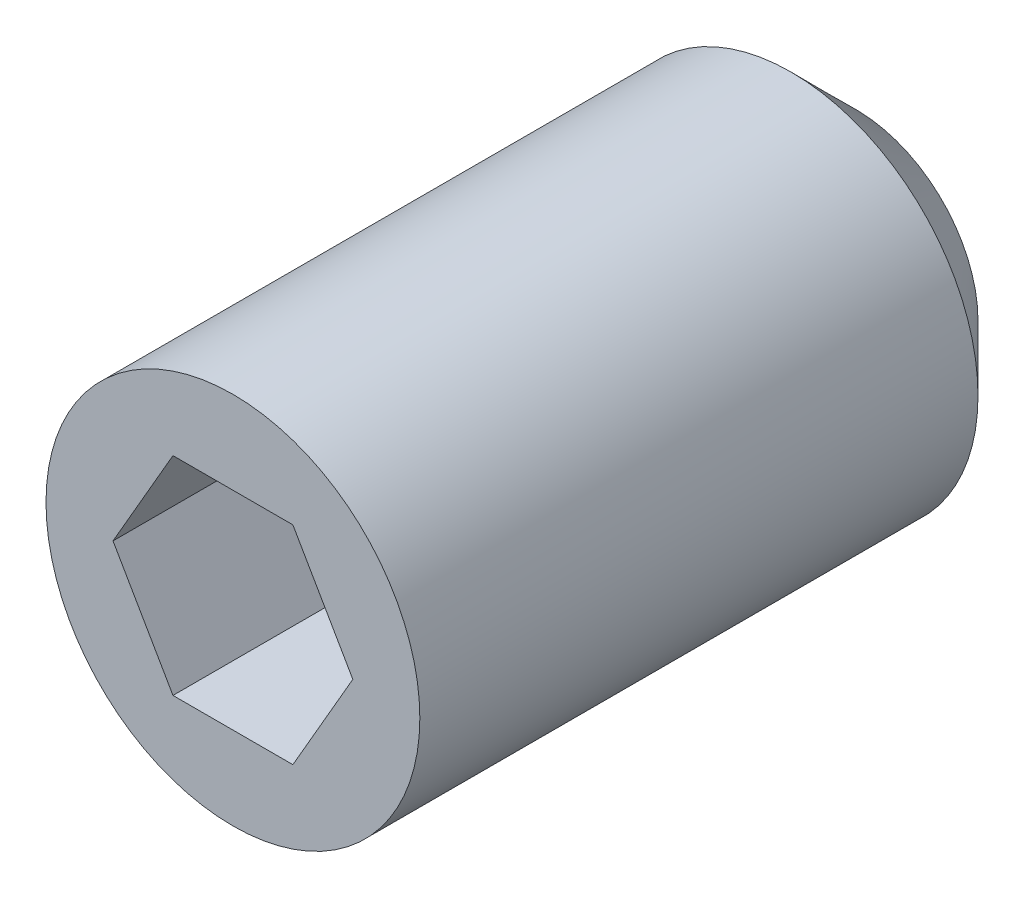
ISO-10303-21;
HEADER;
FILE_DESCRIPTION(('STEP AP214'),'2;1');
FILE_NAME('part.step','',(''),(''),'','','');
FILE_SCHEMA(('AUTOMOTIVE_DESIGN { 1 0 10303 214 1 1 1 1 }'));
ENDSEC;
DATA;
#1=APPLICATION_CONTEXT('core data for automotive mechanical design processes');
#2=APPLICATION_PROTOCOL_DEFINITION('international standard','automotive_design',2000,#1);
#3=PRODUCT_CONTEXT('',#1,'mechanical');
#4=PRODUCT('Part','Part','',(#3));
#5=PRODUCT_RELATED_PRODUCT_CATEGORY('part','',(#4));
#6=PRODUCT_DEFINITION_FORMATION('','',#4);
#7=PRODUCT_DEFINITION_CONTEXT('part definition',#1,'design');
#8=PRODUCT_DEFINITION('design','',#6,#7);
#9=PRODUCT_DEFINITION_SHAPE('','',#8);
#10=(LENGTH_UNIT() NAMED_UNIT(*) SI_UNIT(.MILLI.,.METRE.));
#11=(NAMED_UNIT(*) PLANE_ANGLE_UNIT() SI_UNIT($,.RADIAN.));
#12=(NAMED_UNIT(*) SI_UNIT($,.STERADIAN.) SOLID_ANGLE_UNIT());
#13=UNCERTAINTY_MEASURE_WITH_UNIT(LENGTH_MEASURE(1.E-05),#10,'distance_accuracy_value','');
#14=(GEOMETRIC_REPRESENTATION_CONTEXT(3) GLOBAL_UNCERTAINTY_ASSIGNED_CONTEXT((#13)) GLOBAL_UNIT_ASSIGNED_CONTEXT((#10,
#11,#12)) REPRESENTATION_CONTEXT('',''));
#15=CARTESIAN_POINT('',(0.,0.,0.));
#16=DIRECTION('',(0.,0.,1.));
#17=DIRECTION('',(1.,0.,0.));
#18=AXIS2_PLACEMENT_3D('',#15,#16,#17);
#19=CARTESIAN_POINT('',(0.,0.,3.81));
#20=DIRECTION('',(0.,0.,-1.));
#21=DIRECTION('',(-1.,0.,0.));
#22=AXIS2_PLACEMENT_3D('',#19,#20,#21);
#23=CYLINDRICAL_SURFACE('',#22,1.143);
#24=CARTESIAN_POINT('',(0.,0.,0.396875));
#25=DIRECTION('',(0.,0.,1.));
#26=DIRECTION('',(1.,0.,0.));
#27=AXIS2_PLACEMENT_3D('',#24,#25,#26);
#28=CIRCLE('',#27,1.143);
#29=CARTESIAN_POINT('',(-1.143,0.,0.396875));
#30=VERTEX_POINT('',#29);
#31=EDGE_CURVE('E40',#30,#30,#28,.T.);
#32=CARTESIAN_POINT('',(0.,0.,3.81));
#33=DIRECTION('',(0.,0.,1.));
#34=DIRECTION('',(1.,0.,0.));
#35=AXIS2_PLACEMENT_3D('',#32,#33,#34);
#36=CIRCLE('',#35,1.143);
#37=CARTESIAN_POINT('',(-1.143,0.,3.81));
#38=VERTEX_POINT('',#37);
#39=EDGE_CURVE('E134',#38,#38,#36,.T.);
#40=CARTESIAN_POINT('',(-1.143,0.,0.396875));
#41=CARTESIAN_POINT('',(-1.143,0.,0.432428385416666));
#42=CARTESIAN_POINT('',(-1.143,0.,0.467981770833333));
#43=CARTESIAN_POINT('',(-1.143,0.,0.539088541666666));
#44=CARTESIAN_POINT('',(-1.143,0.,0.574641927083333));
#45=CARTESIAN_POINT('',(-1.143,0.,0.645748697916666));
#46=CARTESIAN_POINT('',(-1.143,0.,0.681302083333333));
#47=CARTESIAN_POINT('',(-1.143,0.,0.752408854166666));
#48=CARTESIAN_POINT('',(-1.143,0.,0.787962239583333));
#49=CARTESIAN_POINT('',(-1.143,0.,0.859069010416666));
#50=CARTESIAN_POINT('',(-1.143,0.,0.894622395833333));
#51=CARTESIAN_POINT('',(-1.143,0.,0.965729166666666));
#52=CARTESIAN_POINT('',(-1.143,0.,1.00128255208333));
#53=CARTESIAN_POINT('',(-1.143,0.,1.07238932291667));
#54=CARTESIAN_POINT('',(-1.143,0.,1.10794270833333));
#55=CARTESIAN_POINT('',(-1.143,0.,1.17904947916667));
#56=CARTESIAN_POINT('',(-1.143,0.,1.21460286458333));
#57=CARTESIAN_POINT('',(-1.143,0.,1.28570963541667));
#58=CARTESIAN_POINT('',(-1.143,0.,1.32126302083333));
#59=CARTESIAN_POINT('',(-1.143,0.,1.39236979166667));
#60=CARTESIAN_POINT('',(-1.143,0.,1.42792317708333));
#61=CARTESIAN_POINT('',(-1.143,0.,1.49902994791667));
#62=CARTESIAN_POINT('',(-1.143,0.,1.53458333333333));
#63=CARTESIAN_POINT('',(-1.143,0.,1.60569010416667));
#64=CARTESIAN_POINT('',(-1.143,0.,1.64124348958333));
#65=CARTESIAN_POINT('',(-1.143,0.,1.71235026041667));
#66=CARTESIAN_POINT('',(-1.143,0.,1.74790364583333));
#67=CARTESIAN_POINT('',(-1.143,0.,1.81901041666667));
#68=CARTESIAN_POINT('',(-1.143,0.,1.85456380208333));
#69=CARTESIAN_POINT('',(-1.143,0.,1.92567057291667));
#70=CARTESIAN_POINT('',(-1.143,0.,1.96122395833333));
#71=CARTESIAN_POINT('',(-1.143,0.,2.03233072916667));
#72=CARTESIAN_POINT('',(-1.143,0.,2.06788411458333));
#73=CARTESIAN_POINT('',(-1.143,0.,2.13899088541667));
#74=CARTESIAN_POINT('',(-1.143,0.,2.17454427083333));
#75=CARTESIAN_POINT('',(-1.143,0.,2.24565104166667));
#76=CARTESIAN_POINT('',(-1.143,0.,2.28120442708333));
#77=CARTESIAN_POINT('',(-1.143,0.,2.35231119791667));
#78=CARTESIAN_POINT('',(-1.143,0.,2.38786458333333));
#79=CARTESIAN_POINT('',(-1.143,0.,2.45897135416667));
#80=CARTESIAN_POINT('',(-1.143,0.,2.49452473958333));
#81=CARTESIAN_POINT('',(-1.143,0.,2.56563151041667));
#82=CARTESIAN_POINT('',(-1.143,0.,2.60118489583333));
#83=CARTESIAN_POINT('',(-1.143,0.,2.67229166666667));
#84=CARTESIAN_POINT('',(-1.143,0.,2.70784505208333));
#85=CARTESIAN_POINT('',(-1.143,0.,2.77895182291667));
#86=CARTESIAN_POINT('',(-1.143,0.,2.81450520833333));
#87=CARTESIAN_POINT('',(-1.143,0.,2.88561197916667));
#88=CARTESIAN_POINT('',(-1.143,0.,2.92116536458333));
#89=CARTESIAN_POINT('',(-1.143,0.,2.99227213541667));
#90=CARTESIAN_POINT('',(-1.143,0.,3.02782552083333));
#91=CARTESIAN_POINT('',(-1.143,0.,3.09893229166667));
#92=CARTESIAN_POINT('',(-1.143,0.,3.13448567708333));
#93=CARTESIAN_POINT('',(-1.143,0.,3.20559244791667));
#94=CARTESIAN_POINT('',(-1.143,0.,3.24114583333333));
#95=CARTESIAN_POINT('',(-1.143,0.,3.31225260416667));
#96=CARTESIAN_POINT('',(-1.143,0.,3.34780598958333));
#97=CARTESIAN_POINT('',(-1.143,0.,3.41891276041667));
#98=CARTESIAN_POINT('',(-1.143,0.,3.45446614583333));
#99=CARTESIAN_POINT('',(-1.143,0.,3.52557291666667));
#100=CARTESIAN_POINT('',(-1.143,0.,3.56112630208333));
#101=CARTESIAN_POINT('',(-1.143,0.,3.63223307291667));
#102=CARTESIAN_POINT('',(-1.143,0.,3.66778645833333));
#103=CARTESIAN_POINT('',(-1.143,0.,3.73889322916667));
#104=CARTESIAN_POINT('',(-1.143,0.,3.77444661458333));
#105=CARTESIAN_POINT('',(-1.143,0.,3.81));
#106=B_SPLINE_CURVE_WITH_KNOTS('',3,(#40,#41,#42,#43,#44,#45,#46,#47,#48,#49,#50,#51,#52,#53,
#54,#55,#56,#57,#58,#59,#60,#61,#62,#63,#64,#65,#66,#67,#68,#69,#70,#71,#72,#73,#74,#75,#76,#77,
#78,#79,#80,#81,#82,#83,#84,#85,#86,#87,#88,#89,#90,#91,#92,#93,#94,#95,#96,#97,#98,#99,#100,
#101,#102,#103,#104,#105),.UNSPECIFIED.,.F.,.F.,(4,2,2,2,2,2,2,2,2,2,2,2,2,2,2,2,2,2,2,2,2,2,2,
2,2,2,2,2,2,2,2,2,4),(0.,0.10666015625,0.2133203125,0.31998046875,0.426640625,0.53330078125,
0.6399609375,0.74662109375,0.85328125,0.95994140625,1.0666015625,1.17326171875,1.279921875,
1.38658203125,1.4932421875,1.59990234375,1.7065625,1.81322265625,1.9198828125,2.02654296875,
2.133203125,2.23986328125,2.3465234375,2.45318359375,2.55984375,2.66650390625,2.7731640625,
2.87982421875,2.986484375,3.09314453125,3.1998046875,3.30646484375,3.413125),.UNSPECIFIED.);
#107=EDGE_CURVE('BSEAM32',#30,#38,#106,.T.);
#108=ORIENTED_EDGE('',*,*,#31,.T.);
#109=ORIENTED_EDGE('',*,*,#39,.F.);
#110=ORIENTED_EDGE('',*,*,#107,.T.);
#111=ORIENTED_EDGE('',*,*,#107,.F.);
#112=EDGE_LOOP('',(#108,#110,#109,#111));
#113=FACE_BOUND('',#112,.T.);
#114=ADVANCED_FACE('F32',(#113),#23,.T.);
#115=CARTESIAN_POINT('',(0.,0.,3.81));
#116=DIRECTION('',(0.,0.,1.));
#117=DIRECTION('',(1.,0.,0.));
#118=AXIS2_PLACEMENT_3D('',#115,#116,#117);
#119=PLANE('',#118);
#120=DIRECTION('',(-0.5,-0.866025403784439,0.));
#121=VECTOR('',#120,1.);
#122=CARTESIAN_POINT('',(-0.733234841870825,0.,3.80999999999764));
#123=LINE('',#122,#121);
#124=CARTESIAN_POINT('',(-0.366617420935412,0.635,3.80999999999764));
#125=VERTEX_POINT('',#124);
#126=CARTESIAN_POINT('',(-0.733234841870825,0.,3.81));
#127=VERTEX_POINT('',#126);
#128=EDGE_CURVE('E47',#125,#127,#123,.T.);
#129=ORIENTED_EDGE('',*,*,#128,.F.);
#130=DIRECTION('',(-1.,0.,0.));
#131=VECTOR('',#130,1.);
#132=CARTESIAN_POINT('',(-0.366617420935412,0.635,3.80999999999764));
#133=LINE('',#132,#131);
#134=CARTESIAN_POINT('',(0.366617420935412,0.635,3.80999999999764));
#135=VERTEX_POINT('',#134);
#136=EDGE_CURVE('E130',#135,#125,#133,.T.);
#137=ORIENTED_EDGE('',*,*,#136,.F.);
#138=DIRECTION('',(-0.5,0.866025403784439,0.));
#139=VECTOR('',#138,1.);
#140=CARTESIAN_POINT('',(0.366617420935412,0.635,3.80999999999764));
#141=LINE('',#140,#139);
#142=CARTESIAN_POINT('',(0.733234841870825,0.,3.80999999999764));
#143=VERTEX_POINT('',#142);
#144=EDGE_CURVE('E128',#143,#135,#141,.T.);
#145=ORIENTED_EDGE('',*,*,#144,.F.);
#146=DIRECTION('',(0.5,0.866025403784439,0.));
#147=VECTOR('',#146,1.);
#148=CARTESIAN_POINT('',(0.733234841870825,0.,3.80999999999764));
#149=LINE('',#148,#147);
#150=CARTESIAN_POINT('',(0.366617420935412,-0.635,3.80999999999764));
#151=VERTEX_POINT('',#150);
#152=EDGE_CURVE('E95',#151,#143,#149,.T.);
#153=ORIENTED_EDGE('',*,*,#152,.F.);
#154=DIRECTION('',(1.,0.,0.));
#155=VECTOR('',#154,1.);
#156=CARTESIAN_POINT('',(0.366617420935412,-0.635,3.80999999999764));
#157=LINE('',#156,#155);
#158=CARTESIAN_POINT('',(-0.366617420935412,-0.635,3.80999999999764));
#159=VERTEX_POINT('',#158);
#160=EDGE_CURVE('E124',#159,#151,#157,.T.);
#161=ORIENTED_EDGE('',*,*,#160,.F.);
#162=DIRECTION('',(0.5,-0.866025403784439,0.));
#163=VECTOR('',#162,1.);
#164=CARTESIAN_POINT('',(-0.366617420935412,-0.635,3.80999999999764));
#165=LINE('',#164,#163);
#166=EDGE_CURVE('E121',#127,#159,#165,.T.);
#167=ORIENTED_EDGE('',*,*,#166,.F.);
#168=EDGE_LOOP('',(#129,#137,#145,#153,#161,#167));
#169=FACE_BOUND('',#168,.T.);
#170=ORIENTED_EDGE('',*,*,#39,.T.);
#171=EDGE_LOOP('',(#170));
#172=FACE_BOUND('',#171,.T.);
#173=ADVANCED_FACE('F155',(#169,#172),#119,.T.);
#174=CARTESIAN_POINT('',(0.,0.,0.));
#175=DIRECTION('',(0.,0.,1.));
#176=DIRECTION('',(1.,0.,0.));
#177=AXIS2_PLACEMENT_3D('',#174,#175,#176);
#178=PLANE('',#177);
#179=CARTESIAN_POINT('',(0.,0.,0.));
#180=DIRECTION('',(0.,0.,1.));
#181=DIRECTION('',(1.,0.,0.));
#182=AXIS2_PLACEMENT_3D('',#179,#180,#181);
#183=CIRCLE('',#182,0.746125);
#184=CARTESIAN_POINT('',(0.746125,0.,0.));
#185=VERTEX_POINT('',#184);
#186=EDGE_CURVE('E11',#185,#185,#183,.F.);
#187=ORIENTED_EDGE('',*,*,#186,.T.);
#188=EDGE_LOOP('',(#187));
#189=FACE_BOUND('',#188,.T.);
#190=ADVANCED_FACE('F159',(#189),#178,.F.);
#191=CARTESIAN_POINT('',(-0.733234841870825,0.,2.22249999999764));
#192=DIRECTION('',(-0.866025403784439,0.5,0.));
#193=DIRECTION('',(-0.5,-0.866025403784439,0.));
#194=AXIS2_PLACEMENT_3D('',#191,#192,#193);
#195=PLANE('',#194);
#196=ORIENTED_EDGE('',*,*,#128,.T.);
#197=DIRECTION('',(0.,0.,1.));
#198=VECTOR('',#197,1.);
#199=CARTESIAN_POINT('',(-0.733234841870825,0.,2.22249999999764));
#200=LINE('',#199,#198);
#201=CARTESIAN_POINT('',(-0.733234841870825,0.,2.22249999999764));
#202=VERTEX_POINT('',#201);
#203=EDGE_CURVE('E77',#202,#127,#200,.T.);
#204=ORIENTED_EDGE('',*,*,#203,.F.);
#205=DIRECTION('',(-0.5,-0.866025403784439,0.));
#206=VECTOR('',#205,1.);
#207=CARTESIAN_POINT('',(-0.733234841870825,0.,2.22249999999764));
#208=LINE('',#207,#206);
#209=CARTESIAN_POINT('',(-0.366617420935412,0.635,2.22249999999764));
#210=VERTEX_POINT('',#209);
#211=EDGE_CURVE('E132',#210,#202,#208,.T.);
#212=ORIENTED_EDGE('',*,*,#211,.F.);
#213=DIRECTION('',(0.,0.,1.));
#214=VECTOR('',#213,1.);
#215=CARTESIAN_POINT('',(-0.366617420935412,0.635,2.22249999999764));
#216=LINE('',#215,#214);
#217=EDGE_CURVE('E55',#210,#125,#216,.T.);
#218=ORIENTED_EDGE('',*,*,#217,.T.);
#219=EDGE_LOOP('',(#196,#204,#212,#218));
#220=FACE_BOUND('',#219,.T.);
#221=ADVANCED_FACE('F164',(#220),#195,.F.);
#222=CARTESIAN_POINT('',(-0.366617420935412,0.635,2.22249999999764));
#223=DIRECTION('',(0.,1.,0.));
#224=DIRECTION('',(0.,0.,1.));
#225=AXIS2_PLACEMENT_3D('',#222,#223,#224);
#226=PLANE('',#225);
#227=ORIENTED_EDGE('',*,*,#136,.T.);
#228=ORIENTED_EDGE('',*,*,#217,.F.);
#229=DIRECTION('',(-1.,0.,0.));
#230=VECTOR('',#229,1.);
#231=CARTESIAN_POINT('',(-0.366617420935412,0.635,2.22249999999764));
#232=LINE('',#231,#230);
#233=CARTESIAN_POINT('',(0.366617420935412,0.635,2.22249999999764));
#234=VERTEX_POINT('',#233);
#235=EDGE_CURVE('E107',#234,#210,#232,.T.);
#236=ORIENTED_EDGE('',*,*,#235,.F.);
#237=DIRECTION('',(0.,0.,1.));
#238=VECTOR('',#237,1.);
#239=CARTESIAN_POINT('',(0.366617420935412,0.635,2.22249999999764));
#240=LINE('',#239,#238);
#241=EDGE_CURVE('E99',#234,#135,#240,.T.);
#242=ORIENTED_EDGE('',*,*,#241,.T.);
#243=EDGE_LOOP('',(#227,#228,#236,#242));
#244=FACE_BOUND('',#243,.T.);
#245=ADVANCED_FACE('F169',(#244),#226,.F.);
#246=CARTESIAN_POINT('',(0.366617420935412,0.635,2.22249999999764));
#247=DIRECTION('',(0.866025403784439,0.5,0.));
#248=DIRECTION('',(-0.5,0.866025403784439,0.));
#249=AXIS2_PLACEMENT_3D('',#246,#247,#248);
#250=PLANE('',#249);
#251=ORIENTED_EDGE('',*,*,#144,.T.);
#252=ORIENTED_EDGE('',*,*,#241,.F.);
#253=DIRECTION('',(-0.5,0.866025403784439,0.));
#254=VECTOR('',#253,1.);
#255=CARTESIAN_POINT('',(0.366617420935412,0.635,2.22249999999764));
#256=LINE('',#255,#254);
#257=CARTESIAN_POINT('',(0.733234841870825,0.,2.22249999999764));
#258=VERTEX_POINT('',#257);
#259=EDGE_CURVE('E103',#258,#234,#256,.T.);
#260=ORIENTED_EDGE('',*,*,#259,.F.);
#261=DIRECTION('',(0.,0.,1.));
#262=VECTOR('',#261,1.);
#263=CARTESIAN_POINT('',(0.733234841870825,0.,2.22249999999764));
#264=LINE('',#263,#262);
#265=EDGE_CURVE('E88',#258,#143,#264,.T.);
#266=ORIENTED_EDGE('',*,*,#265,.T.);
#267=EDGE_LOOP('',(#251,#252,#260,#266));
#268=FACE_BOUND('',#267,.T.);
#269=ADVANCED_FACE('F104',(#268),#250,.F.);
#270=CARTESIAN_POINT('',(0.733234841870825,0.,2.22249999999764));
#271=DIRECTION('',(0.866025403784439,-0.5,0.));
#272=DIRECTION('',(0.5,0.866025403784439,0.));
#273=AXIS2_PLACEMENT_3D('',#270,#271,#272);
#274=PLANE('',#273);
#275=ORIENTED_EDGE('',*,*,#152,.T.);
#276=ORIENTED_EDGE('',*,*,#265,.F.);
#277=DIRECTION('',(0.5,0.866025403784439,0.));
#278=VECTOR('',#277,1.);
#279=CARTESIAN_POINT('',(0.733234841870825,0.,2.22249999999764));
#280=LINE('',#279,#278);
#281=CARTESIAN_POINT('',(0.366617420935412,-0.635,2.22249999999764));
#282=VERTEX_POINT('',#281);
#283=EDGE_CURVE('E92',#282,#258,#280,.T.);
#284=ORIENTED_EDGE('',*,*,#283,.F.);
#285=DIRECTION('',(0.,0.,1.));
#286=VECTOR('',#285,1.);
#287=CARTESIAN_POINT('',(0.366617420935412,-0.635,2.22249999999764));
#288=LINE('',#287,#286);
#289=EDGE_CURVE('E100',#282,#151,#288,.T.);
#290=ORIENTED_EDGE('',*,*,#289,.T.);
#291=EDGE_LOOP('',(#275,#276,#284,#290));
#292=FACE_BOUND('',#291,.T.);
#293=ADVANCED_FACE('F90',(#292),#274,.F.);
#294=CARTESIAN_POINT('',(0.366617420935412,-0.635,2.22249999999764));
#295=DIRECTION('',(0.,-1.,0.));
#296=DIRECTION('',(1.,0.,0.));
#297=AXIS2_PLACEMENT_3D('',#294,#295,#296);
#298=PLANE('',#297);
#299=ORIENTED_EDGE('',*,*,#160,.T.);
#300=ORIENTED_EDGE('',*,*,#289,.F.);
#301=DIRECTION('',(1.,0.,0.));
#302=VECTOR('',#301,1.);
#303=CARTESIAN_POINT('',(0.366617420935412,-0.635,2.22249999999764));
#304=LINE('',#303,#302);
#305=CARTESIAN_POINT('',(-0.366617420935412,-0.635,2.22249999999764));
#306=VERTEX_POINT('',#305);
#307=EDGE_CURVE('E113',#306,#282,#304,.T.);
#308=ORIENTED_EDGE('',*,*,#307,.F.);
#309=DIRECTION('',(0.,0.,1.));
#310=VECTOR('',#309,1.);
#311=CARTESIAN_POINT('',(-0.366617420935412,-0.635,2.22249999999764));
#312=LINE('',#311,#310);
#313=EDGE_CURVE('E137',#306,#159,#312,.T.);
#314=ORIENTED_EDGE('',*,*,#313,.T.);
#315=EDGE_LOOP('',(#299,#300,#308,#314));
#316=FACE_BOUND('',#315,.T.);
#317=ADVANCED_FACE('F172',(#316),#298,.F.);
#318=CARTESIAN_POINT('',(-0.366617420935412,-0.635,2.22249999999764));
#319=DIRECTION('',(-0.866025403784439,-0.5,0.));
#320=DIRECTION('',(0.5,-0.866025403784439,0.));
#321=AXIS2_PLACEMENT_3D('',#318,#319,#320);
#322=PLANE('',#321);
#323=ORIENTED_EDGE('',*,*,#166,.T.);
#324=ORIENTED_EDGE('',*,*,#313,.F.);
#325=DIRECTION('',(0.5,-0.866025403784439,0.));
#326=VECTOR('',#325,1.);
#327=CARTESIAN_POINT('',(-0.366617420935412,-0.635,2.22249999999764));
#328=LINE('',#327,#326);
#329=EDGE_CURVE('E115',#202,#306,#328,.T.);
#330=ORIENTED_EDGE('',*,*,#329,.F.);
#331=ORIENTED_EDGE('',*,*,#203,.T.);
#332=EDGE_LOOP('',(#323,#324,#330,#331));
#333=FACE_BOUND('',#332,.T.);
#334=ADVANCED_FACE('F151',(#333),#322,.F.);
#335=CARTESIAN_POINT('',(-1.09985226280624,-0.635,2.22249999999764));
#336=DIRECTION('',(0.,0.,1.));
#337=DIRECTION('',(1.,0.,0.));
#338=AXIS2_PLACEMENT_3D('',#335,#336,#337);
#339=PLANE('',#338);
#340=ORIENTED_EDGE('',*,*,#211,.T.);
#341=ORIENTED_EDGE('',*,*,#329,.T.);
#342=ORIENTED_EDGE('',*,*,#307,.T.);
#343=ORIENTED_EDGE('',*,*,#283,.T.);
#344=ORIENTED_EDGE('',*,*,#259,.T.);
#345=ORIENTED_EDGE('',*,*,#235,.T.);
#346=EDGE_LOOP('',(#340,#341,#342,#343,#344,#345));
#347=FACE_BOUND('',#346,.T.);
#348=ADVANCED_FACE('F110',(#347),#339,.T.);
#349=CARTESIAN_POINT('',(0.,0.,0.396875));
#350=DIRECTION('',(0.,0.,1.));
#351=DIRECTION('',(1.,0.,0.));
#352=AXIS2_PLACEMENT_3D('',#349,#350,#351);
#353=CONICAL_SURFACE('',#352,1.143,0.78539816339745);
#354=ORIENTED_EDGE('',*,*,#186,.F.);
#355=EDGE_LOOP('',(#354));
#356=FACE_BOUND('',#355,.T.);
#357=ORIENTED_EDGE('',*,*,#31,.F.);
#358=EDGE_LOOP('',(#357));
#359=FACE_BOUND('',#358,.T.);
#360=ADVANCED_FACE('F34',(#356,#359),#353,.T.);
#361=CLOSED_SHELL('',(#114,#173,#190,#221,#245,#269,#293,#317,#334,#348,#360));
#362=MANIFOLD_SOLID_BREP('B2',#361);
#363=ADVANCED_BREP_SHAPE_REPRESENTATION('',(#18,#362),#14);
#364=SHAPE_DEFINITION_REPRESENTATION(#9,#363);
ENDSEC;
END-ISO-10303-21;
